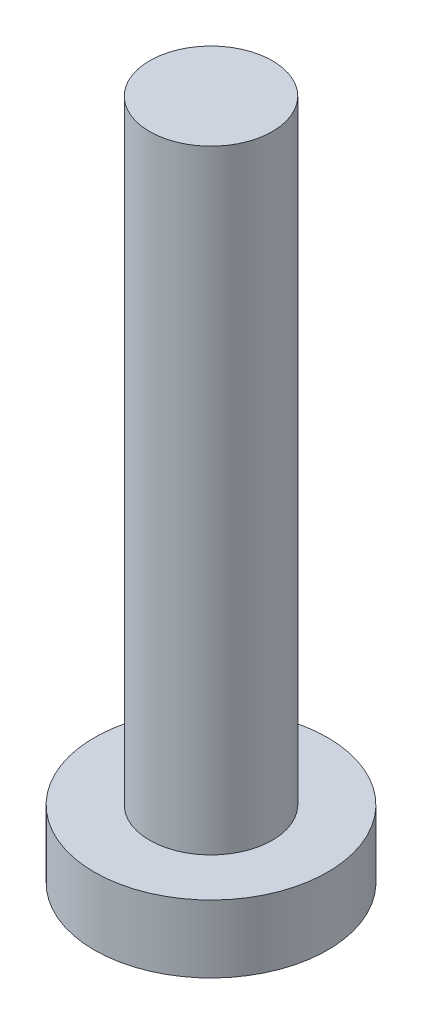
ISO-10303-21;
HEADER;
FILE_DESCRIPTION(('STEP AP214'),'2;1');
FILE_NAME('part.step','',(''),(''),'','','');
FILE_SCHEMA(('AUTOMOTIVE_DESIGN { 1 0 10303 214 1 1 1 1 }'));
ENDSEC;
DATA;
#1=APPLICATION_CONTEXT('core data for automotive mechanical design processes');
#2=APPLICATION_PROTOCOL_DEFINITION('international standard','automotive_design',2000,#1);
#3=PRODUCT_CONTEXT('',#1,'mechanical');
#4=PRODUCT('Part','Part','',(#3));
#5=PRODUCT_RELATED_PRODUCT_CATEGORY('part','',(#4));
#6=PRODUCT_DEFINITION_FORMATION('','',#4);
#7=PRODUCT_DEFINITION_CONTEXT('part definition',#1,'design');
#8=PRODUCT_DEFINITION('design','',#6,#7);
#9=PRODUCT_DEFINITION_SHAPE('','',#8);
#10=(LENGTH_UNIT() NAMED_UNIT(*) SI_UNIT(.MILLI.,.METRE.));
#11=(NAMED_UNIT(*) PLANE_ANGLE_UNIT() SI_UNIT($,.RADIAN.));
#12=(NAMED_UNIT(*) SI_UNIT($,.STERADIAN.) SOLID_ANGLE_UNIT());
#13=UNCERTAINTY_MEASURE_WITH_UNIT(LENGTH_MEASURE(1.E-05),#10,'distance_accuracy_value','');
#14=(GEOMETRIC_REPRESENTATION_CONTEXT(3) GLOBAL_UNCERTAINTY_ASSIGNED_CONTEXT((#13)) GLOBAL_UNIT_ASSIGNED_CONTEXT((#10,
#11,#12)) REPRESENTATION_CONTEXT('',''));
#15=CARTESIAN_POINT('',(0.,0.,0.));
#16=DIRECTION('',(0.,0.,1.));
#17=DIRECTION('',(1.,0.,0.));
#18=AXIS2_PLACEMENT_3D('',#15,#16,#17);
#19=CARTESIAN_POINT('',(0.,20.,0.));
#20=DIRECTION('',(0.,1.,0.));
#21=DIRECTION('',(1.,0.,0.));
#22=AXIS2_PLACEMENT_3D('',#19,#20,#21);
#23=PLANE('',#22);
#24=CARTESIAN_POINT('',(0.,20.,0.));
#25=DIRECTION('',(0.,1.,0.));
#26=DIRECTION('',(0.,0.,1.));
#27=AXIS2_PLACEMENT_3D('',#24,#25,#26);
#28=CIRCLE('',#27,2.);
#29=CARTESIAN_POINT('',(0.,20.,2.));
#30=VERTEX_POINT('',#29);
#31=EDGE_CURVE('E10',#30,#30,#28,.T.);
#32=ORIENTED_EDGE('',*,*,#31,.T.);
#33=EDGE_LOOP('',(#32));
#34=FACE_BOUND('',#33,.T.);
#35=ADVANCED_FACE('F15',(#34),#23,.T.);
#36=CARTESIAN_POINT('',(0.,0.,0.));
#37=DIRECTION('',(0.,1.,0.));
#38=DIRECTION('',(0.,0.,1.));
#39=AXIS2_PLACEMENT_3D('',#36,#37,#38);
#40=CYLINDRICAL_SURFACE('',#39,2.);
#41=ORIENTED_EDGE('',*,*,#31,.F.);
#42=EDGE_LOOP('',(#41));
#43=FACE_BOUND('',#42,.T.);
#44=CARTESIAN_POINT('',(0.,0.,0.));
#45=DIRECTION('',(0.,1.,0.));
#46=DIRECTION('',(0.,0.,1.));
#47=AXIS2_PLACEMENT_3D('',#44,#45,#46);
#48=CIRCLE('',#47,2.);
#49=CARTESIAN_POINT('',(0.,0.,2.));
#50=VERTEX_POINT('',#49);
#51=EDGE_CURVE('E22',#50,#50,#48,.T.);
#52=ORIENTED_EDGE('',*,*,#51,.T.);
#53=EDGE_LOOP('',(#52));
#54=FACE_BOUND('',#53,.T.);
#55=ADVANCED_FACE('F54',(#43,#54),#40,.T.);
#56=CARTESIAN_POINT('',(0.,-2.2,0.));
#57=DIRECTION('',(0.,1.,0.));
#58=DIRECTION('',(1.,0.,0.));
#59=AXIS2_PLACEMENT_3D('',#56,#57,#58);
#60=PLANE('',#59);
#61=CARTESIAN_POINT('',(0.,-2.2,0.));
#62=DIRECTION('',(0.,1.,0.));
#63=DIRECTION('',(0.,0.,1.));
#64=AXIS2_PLACEMENT_3D('',#61,#62,#63);
#65=CIRCLE('',#64,3.8);
#66=CARTESIAN_POINT('',(0.,-2.2,3.8));
#67=VERTEX_POINT('',#66);
#68=EDGE_CURVE('E30',#67,#67,#65,.T.);
#69=ORIENTED_EDGE('',*,*,#68,.F.);
#70=EDGE_LOOP('',(#69));
#71=FACE_BOUND('',#70,.T.);
#72=ADVANCED_FACE('F52',(#71),#60,.F.);
#73=CARTESIAN_POINT('',(0.,0.,0.));
#74=DIRECTION('',(0.,1.,0.));
#75=DIRECTION('',(1.,0.,0.));
#76=AXIS2_PLACEMENT_3D('',#73,#74,#75);
#77=PLANE('',#76);
#78=ORIENTED_EDGE('',*,*,#51,.F.);
#79=EDGE_LOOP('',(#78));
#80=FACE_BOUND('',#79,.T.);
#81=CARTESIAN_POINT('',(0.,0.,0.));
#82=DIRECTION('',(0.,1.,0.));
#83=DIRECTION('',(0.,0.,1.));
#84=AXIS2_PLACEMENT_3D('',#81,#82,#83);
#85=CIRCLE('',#84,3.8);
#86=CARTESIAN_POINT('',(0.,0.,3.8));
#87=VERTEX_POINT('',#86);
#88=EDGE_CURVE('E36',#87,#87,#85,.T.);
#89=ORIENTED_EDGE('',*,*,#88,.T.);
#90=EDGE_LOOP('',(#89));
#91=FACE_BOUND('',#90,.T.);
#92=ADVANCED_FACE('F44',(#80,#91),#77,.T.);
#93=CARTESIAN_POINT('',(0.,-2.2,0.));
#94=DIRECTION('',(0.,1.,0.));
#95=DIRECTION('',(0.,0.,1.));
#96=AXIS2_PLACEMENT_3D('',#93,#94,#95);
#97=CYLINDRICAL_SURFACE('',#96,3.8);
#98=ORIENTED_EDGE('',*,*,#88,.F.);
#99=EDGE_LOOP('',(#98));
#100=FACE_BOUND('',#99,.T.);
#101=ORIENTED_EDGE('',*,*,#68,.T.);
#102=EDGE_LOOP('',(#101));
#103=FACE_BOUND('',#102,.T.);
#104=ADVANCED_FACE('F46',(#100,#103),#97,.T.);
#105=CLOSED_SHELL('',(#35,#55,#72,#92,#104));
#106=MANIFOLD_SOLID_BREP('B1',#105);
#107=ADVANCED_BREP_SHAPE_REPRESENTATION('',(#18,#106),#14);
#108=SHAPE_DEFINITION_REPRESENTATION(#9,#107);
ENDSEC;
END-ISO-10303-21;
